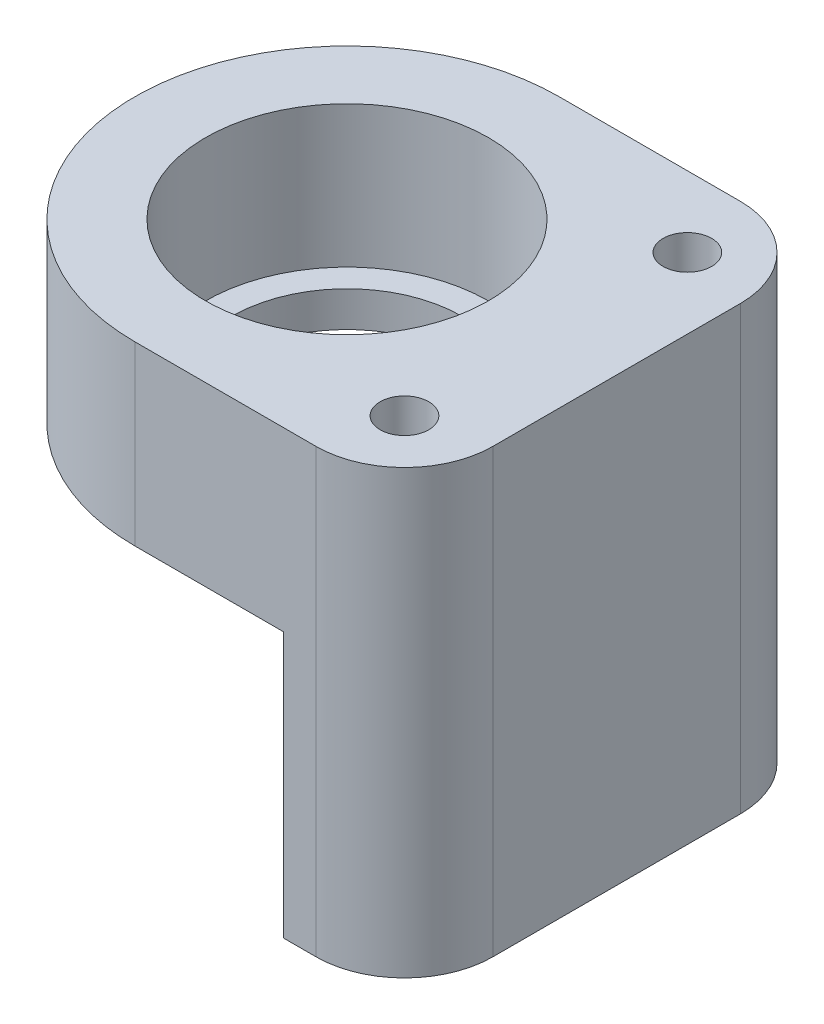
ISO-10303-21;
HEADER;
FILE_DESCRIPTION(('STEP AP214'),'2;1');
FILE_NAME('part.step','',(''),(''),'','','');
FILE_SCHEMA(('AUTOMOTIVE_DESIGN { 1 0 10303 214 1 1 1 1 }'));
ENDSEC;
DATA;
#1=APPLICATION_CONTEXT('core data for automotive mechanical design processes');
#2=APPLICATION_PROTOCOL_DEFINITION('international standard','automotive_design',2000,#1);
#3=PRODUCT_CONTEXT('',#1,'mechanical');
#4=PRODUCT('Part','Part','',(#3));
#5=PRODUCT_RELATED_PRODUCT_CATEGORY('part','',(#4));
#6=PRODUCT_DEFINITION_FORMATION('','',#4);
#7=PRODUCT_DEFINITION_CONTEXT('part definition',#1,'design');
#8=PRODUCT_DEFINITION('design','',#6,#7);
#9=PRODUCT_DEFINITION_SHAPE('','',#8);
#10=(LENGTH_UNIT() NAMED_UNIT(*) SI_UNIT(.MILLI.,.METRE.));
#11=(NAMED_UNIT(*) PLANE_ANGLE_UNIT() SI_UNIT($,.RADIAN.));
#12=(NAMED_UNIT(*) SI_UNIT($,.STERADIAN.) SOLID_ANGLE_UNIT());
#13=UNCERTAINTY_MEASURE_WITH_UNIT(LENGTH_MEASURE(1.E-05),#10,'distance_accuracy_value','');
#14=(GEOMETRIC_REPRESENTATION_CONTEXT(3) GLOBAL_UNCERTAINTY_ASSIGNED_CONTEXT((#13)) GLOBAL_UNIT_ASSIGNED_CONTEXT((#10,
#11,#12)) REPRESENTATION_CONTEXT('',''));
#15=CARTESIAN_POINT('',(0.,0.,0.));
#16=DIRECTION('',(0.,0.,1.));
#17=DIRECTION('',(1.,0.,0.));
#18=AXIS2_PLACEMENT_3D('',#15,#16,#17);
#19=CARTESIAN_POINT('',(-24.,0.,0.));
#20=DIRECTION('',(0.,1.,0.));
#21=DIRECTION('',(0.,0.,1.));
#22=AXIS2_PLACEMENT_3D('',#19,#20,#21);
#23=PLANE('',#22);
#24=CARTESIAN_POINT('',(22.5,0.,-16.));
#25=DIRECTION('',(0.,-1.,0.));
#26=DIRECTION('',(0.,0.,-1.));
#27=AXIS2_PLACEMENT_3D('',#24,#25,#26);
#28=CIRCLE('',#27,2.74999999999999);
#29=CARTESIAN_POINT('',(22.5,0.,-18.75));
#30=VERTEX_POINT('',#29);
#31=EDGE_CURVE('E383',#30,#30,#28,.T.);
#32=ORIENTED_EDGE('',*,*,#31,.F.);
#33=EDGE_LOOP('',(#32));
#34=FACE_BOUND('',#33,.T.);
#35=CARTESIAN_POINT('',(24.5,0.,9.));
#36=DIRECTION('',(0.,-1.,0.));
#37=DIRECTION('',(0.,0.,-1.));
#38=AXIS2_PLACEMENT_3D('',#35,#36,#37);
#39=CIRCLE('',#38,1.49999999999999);
#40=CARTESIAN_POINT('',(24.5,0.,7.50000000000001));
#41=VERTEX_POINT('',#40);
#42=EDGE_CURVE('E148',#41,#41,#39,.T.);
#43=ORIENTED_EDGE('',*,*,#42,.F.);
#44=EDGE_LOOP('',(#43));
#45=FACE_BOUND('',#44,.T.);
#46=CARTESIAN_POINT('',(24.5,0.,-9.));
#47=DIRECTION('',(0.,-1.,0.));
#48=DIRECTION('',(0.,0.,-1.));
#49=AXIS2_PLACEMENT_3D('',#46,#47,#48);
#50=CIRCLE('',#49,1.49999999999999);
#51=CARTESIAN_POINT('',(24.5,0.,-10.5));
#52=VERTEX_POINT('',#51);
#53=EDGE_CURVE('E147',#52,#52,#50,.T.);
#54=ORIENTED_EDGE('',*,*,#53,.F.);
#55=EDGE_LOOP('',(#54));
#56=FACE_BOUND('',#55,.T.);
#57=DIRECTION('',(-0.308662393745259,0.,-0.951171659947586));
#58=VECTOR('',#57,1.);
#59=CARTESIAN_POINT('',(15.0852726124611,0.,18.6664016405876));
#60=LINE('',#59,#58);
#61=CARTESIAN_POINT('',(16.8160655978017,0.,24.));
#62=VERTEX_POINT('',#61);
#63=CARTESIAN_POINT('',(15.0852726124611,0.,18.6664016405876));
#64=VERTEX_POINT('',#63);
#65=EDGE_CURVE('E163',#62,#64,#60,.T.);
#66=ORIENTED_EDGE('',*,*,#65,.T.);
#67=DIRECTION('',(-0.628553025519213,0.,-0.777766735024483));
#68=VECTOR('',#67,1.);
#69=CARTESIAN_POINT('',(0.,0.,0.));
#70=LINE('',#69,#68);
#71=CARTESIAN_POINT('',(12.5710605103843,0.,15.5553347004896));
#72=VERTEX_POINT('',#71);
#73=EDGE_CURVE('E178',#64,#72,#70,.T.);
#74=ORIENTED_EDGE('',*,*,#73,.T.);
#75=CARTESIAN_POINT('',(0.,0.,0.));
#76=DIRECTION('',(0.,-1.,0.));
#77=DIRECTION('',(0.,0.,-1.));
#78=AXIS2_PLACEMENT_3D('',#75,#76,#77);
#79=CIRCLE('',#78,20.);
#80=CARTESIAN_POINT('',(-5.76280411150831,0.,-19.1517646386014));
#81=VERTEX_POINT('',#80);
#82=EDGE_CURVE('E256',#81,#72,#79,.T.);
#83=ORIENTED_EDGE('',*,*,#82,.F.);
#84=DIRECTION('',(-0.288140205575415,0.,-0.95758823193007));
#85=VECTOR('',#84,1.);
#86=CARTESIAN_POINT('',(-6.91536493380997,0.,-22.9821175663217));
#87=LINE('',#86,#85);
#88=CARTESIAN_POINT('',(-6.91536493380997,0.,-22.9821175663217));
#89=VERTEX_POINT('',#88);
#90=EDGE_CURVE('E167',#81,#89,#87,.T.);
#91=ORIENTED_EDGE('',*,*,#90,.T.);
#92=CARTESIAN_POINT('',(0.,0.,0.));
#93=DIRECTION('',(0.,-1.,0.));
#94=DIRECTION('',(0.,0.,-1.));
#95=AXIS2_PLACEMENT_3D('',#92,#93,#94);
#96=CIRCLE('',#95,24.);
#97=CARTESIAN_POINT('',(0.,0.,-24.));
#98=VERTEX_POINT('',#97);
#99=EDGE_CURVE('E77',#89,#98,#96,.T.);
#100=ORIENTED_EDGE('',*,*,#99,.T.);
#101=DIRECTION('',(1.,0.,0.));
#102=VECTOR('',#101,1.);
#103=CARTESIAN_POINT('',(20.5,0.,-24.));
#104=LINE('',#103,#102);
#105=CARTESIAN_POINT('',(20.5,0.,-24.));
#106=VERTEX_POINT('',#105);
#107=EDGE_CURVE('E208',#98,#106,#104,.T.);
#108=ORIENTED_EDGE('',*,*,#107,.T.);
#109=CARTESIAN_POINT('',(20.5,0.,-14.));
#110=DIRECTION('',(0.,1.,0.));
#111=DIRECTION('',(0.,0.,1.));
#112=AXIS2_PLACEMENT_3D('',#109,#110,#111);
#113=CIRCLE('',#112,10.);
#114=CARTESIAN_POINT('',(30.5,0.,-14.));
#115=VERTEX_POINT('',#114);
#116=EDGE_CURVE('E205',#106,#115,#113,.F.);
#117=ORIENTED_EDGE('',*,*,#116,.T.);
#118=DIRECTION('',(0.,0.,1.));
#119=VECTOR('',#118,1.);
#120=CARTESIAN_POINT('',(30.5,0.,14.));
#121=LINE('',#120,#119);
#122=CARTESIAN_POINT('',(30.5,0.,14.));
#123=VERTEX_POINT('',#122);
#124=EDGE_CURVE('E66',#115,#123,#121,.T.);
#125=ORIENTED_EDGE('',*,*,#124,.T.);
#126=CARTESIAN_POINT('',(20.5,0.,14.));
#127=DIRECTION('',(0.,1.,0.));
#128=DIRECTION('',(0.,0.,1.));
#129=AXIS2_PLACEMENT_3D('',#126,#127,#128);
#130=CIRCLE('',#129,10.);
#131=CARTESIAN_POINT('',(20.5,0.,24.));
#132=VERTEX_POINT('',#131);
#133=EDGE_CURVE('E82',#123,#132,#130,.F.);
#134=ORIENTED_EDGE('',*,*,#133,.T.);
#135=DIRECTION('',(-1.,0.,0.));
#136=VECTOR('',#135,1.);
#137=CARTESIAN_POINT('',(0.,0.,24.));
#138=LINE('',#137,#136);
#139=EDGE_CURVE('E211',#132,#62,#138,.T.);
#140=ORIENTED_EDGE('',*,*,#139,.T.);
#141=EDGE_LOOP('',(#66,#74,#83,#91,#100,#108,#117,#125,#134,#140));
#142=FACE_BOUND('',#141,.T.);
#143=CARTESIAN_POINT('',(22.5,0.,16.));
#144=DIRECTION('',(0.,-1.,0.));
#145=DIRECTION('',(0.,0.,-1.));
#146=AXIS2_PLACEMENT_3D('',#143,#144,#145);
#147=CIRCLE('',#146,2.74999999999999);
#148=CARTESIAN_POINT('',(22.5,0.,13.25));
#149=VERTEX_POINT('',#148);
#150=EDGE_CURVE('E390',#149,#149,#147,.T.);
#151=ORIENTED_EDGE('',*,*,#150,.F.);
#152=EDGE_LOOP('',(#151));
#153=FACE_BOUND('',#152,.T.);
#154=ADVANCED_FACE('F41',(#34,#45,#56,#142,#153),#23,.F.);
#155=CARTESIAN_POINT('',(0.,0.,0.));
#156=DIRECTION('',(0.,-1.,0.));
#157=DIRECTION('',(0.,0.,-1.));
#158=AXIS2_PLACEMENT_3D('',#155,#156,#157);
#159=CYLINDRICAL_SURFACE('',#158,20.);
#160=DIRECTION('',(0.,-1.,0.));
#161=VECTOR('',#160,1.);
#162=CARTESIAN_POINT('',(12.5710605103843,0.,15.5553347004897));
#163=LINE('',#162,#161);
#164=CARTESIAN_POINT('',(12.5710605103843,30.,15.5553347004897));
#165=VERTEX_POINT('',#164);
#166=EDGE_CURVE('E196',#165,#72,#163,.T.);
#167=ORIENTED_EDGE('',*,*,#166,.F.);
#168=CARTESIAN_POINT('',(0.,30.,0.));
#169=DIRECTION('',(0.,-1.,0.));
#170=DIRECTION('',(0.,0.,-1.));
#171=AXIS2_PLACEMENT_3D('',#168,#169,#170);
#172=CIRCLE('',#171,20.);
#173=CARTESIAN_POINT('',(-5.76280411150831,30.,-19.1517646386014));
#174=VERTEX_POINT('',#173);
#175=EDGE_CURVE('E260',#174,#165,#172,.T.);
#176=ORIENTED_EDGE('',*,*,#175,.F.);
#177=DIRECTION('',(0.,-1.,0.));
#178=VECTOR('',#177,1.);
#179=CARTESIAN_POINT('',(-5.76280411150831,0.,-19.1517646386014));
#180=LINE('',#179,#178);
#181=EDGE_CURVE('E193',#81,#174,#180,.F.);
#182=ORIENTED_EDGE('',*,*,#181,.F.);
#183=ORIENTED_EDGE('',*,*,#82,.T.);
#184=EDGE_LOOP('',(#167,#176,#182,#183));
#185=FACE_BOUND('',#184,.T.);
#186=ADVANCED_FACE('F323',(#185),#159,.F.);
#187=CARTESIAN_POINT('',(0.,0.,0.));
#188=DIRECTION('',(0.,-1.,0.));
#189=DIRECTION('',(0.,0.,-1.));
#190=AXIS2_PLACEMENT_3D('',#187,#188,#189);
#191=CYLINDRICAL_SURFACE('',#190,24.);
#192=DIRECTION('',(0.,-1.,0.));
#193=VECTOR('',#192,1.);
#194=CARTESIAN_POINT('',(-6.91536493380997,30.,-22.9821175663217));
#195=LINE('',#194,#193);
#196=CARTESIAN_POINT('',(-6.91536493380997,30.,-22.9821175663217));
#197=VERTEX_POINT('',#196);
#198=EDGE_CURVE('E174',#197,#89,#195,.T.);
#199=ORIENTED_EDGE('',*,*,#198,.F.);
#200=CARTESIAN_POINT('',(0.,30.,0.));
#201=DIRECTION('',(0.,1.,0.));
#202=DIRECTION('',(0.,0.,1.));
#203=AXIS2_PLACEMENT_3D('',#200,#201,#202);
#204=CIRCLE('',#203,24.);
#205=CARTESIAN_POINT('',(0.,30.,24.));
#206=VERTEX_POINT('',#205);
#207=EDGE_CURVE('E189',#197,#206,#204,.T.);
#208=ORIENTED_EDGE('',*,*,#207,.T.);
#209=DIRECTION('',(0.,1.,0.));
#210=VECTOR('',#209,1.);
#211=CARTESIAN_POINT('',(0.,-56.8704668523127,24.));
#212=LINE('',#211,#210);
#213=CARTESIAN_POINT('',(0.,50.,24.));
#214=VERTEX_POINT('',#213);
#215=EDGE_CURVE('E231',#206,#214,#212,.T.);
#216=ORIENTED_EDGE('',*,*,#215,.T.);
#217=CARTESIAN_POINT('',(0.,50.,0.));
#218=DIRECTION('',(0.,-1.,0.));
#219=DIRECTION('',(0.,0.,-1.));
#220=AXIS2_PLACEMENT_3D('',#217,#218,#219);
#221=CIRCLE('',#220,24.);
#222=CARTESIAN_POINT('',(0.,50.,-24.));
#223=VERTEX_POINT('',#222);
#224=EDGE_CURVE('E250',#214,#223,#221,.T.);
#225=ORIENTED_EDGE('',*,*,#224,.T.);
#226=DIRECTION('',(0.,1.,0.));
#227=VECTOR('',#226,1.);
#228=CARTESIAN_POINT('',(0.,-56.8704668523127,-24.));
#229=LINE('',#228,#227);
#230=EDGE_CURVE('E202',#98,#223,#229,.T.);
#231=ORIENTED_EDGE('',*,*,#230,.F.);
#232=ORIENTED_EDGE('',*,*,#99,.F.);
#233=EDGE_LOOP('',(#199,#208,#216,#225,#231,#232));
#234=FACE_BOUND('',#233,.T.);
#235=ADVANCED_FACE('F288',(#234),#191,.T.);
#236=CARTESIAN_POINT('',(0.,-56.8704668523127,24.));
#237=DIRECTION('',(0.,0.,1.));
#238=DIRECTION('',(1.,0.,0.));
#239=AXIS2_PLACEMENT_3D('',#236,#237,#238);
#240=PLANE('',#239);
#241=DIRECTION('',(-1.,0.,0.));
#242=VECTOR('',#241,1.);
#243=CARTESIAN_POINT('',(0.,30.,24.));
#244=LINE('',#243,#242);
#245=CARTESIAN_POINT('',(16.8160655978017,30.,24.));
#246=VERTEX_POINT('',#245);
#247=EDGE_CURVE('E50',#246,#206,#244,.T.);
#248=ORIENTED_EDGE('',*,*,#247,.F.);
#249=DIRECTION('',(0.,-1.,0.));
#250=VECTOR('',#249,1.);
#251=CARTESIAN_POINT('',(16.8160655978017,-56.8704668523127,24.));
#252=LINE('',#251,#250);
#253=EDGE_CURVE('E11',#246,#62,#252,.T.);
#254=ORIENTED_EDGE('',*,*,#253,.T.);
#255=ORIENTED_EDGE('',*,*,#139,.F.);
#256=DIRECTION('',(0.,1.,0.));
#257=VECTOR('',#256,1.);
#258=CARTESIAN_POINT('',(20.5,-56.8704668523127,24.));
#259=LINE('',#258,#257);
#260=CARTESIAN_POINT('',(20.5,50.,24.));
#261=VERTEX_POINT('',#260);
#262=EDGE_CURVE('E243',#132,#261,#259,.T.);
#263=ORIENTED_EDGE('',*,*,#262,.T.);
#264=DIRECTION('',(1.,0.,0.));
#265=VECTOR('',#264,1.);
#266=CARTESIAN_POINT('',(0.,50.,24.));
#267=LINE('',#266,#265);
#268=EDGE_CURVE('E199',#214,#261,#267,.T.);
#269=ORIENTED_EDGE('',*,*,#268,.F.);
#270=ORIENTED_EDGE('',*,*,#215,.F.);
#271=EDGE_LOOP('',(#248,#254,#255,#263,#269,#270));
#272=FACE_BOUND('',#271,.T.);
#273=ADVANCED_FACE('F290',(#272),#240,.T.);
#274=CARTESIAN_POINT('',(-16.,50.,0.));
#275=DIRECTION('',(0.,-1.,0.));
#276=DIRECTION('',(0.,0.,-1.));
#277=AXIS2_PLACEMENT_3D('',#274,#275,#276);
#278=PLANE('',#277);
#279=CARTESIAN_POINT('',(22.5,50.,16.));
#280=DIRECTION('',(0.,-1.,0.));
#281=DIRECTION('',(0.,0.,-1.));
#282=AXIS2_PLACEMENT_3D('',#279,#280,#281);
#283=CIRCLE('',#282,2.74999999999999);
#284=CARTESIAN_POINT('',(22.5,50.,13.25));
#285=VERTEX_POINT('',#284);
#286=EDGE_CURVE('E378',#285,#285,#283,.T.);
#287=ORIENTED_EDGE('',*,*,#286,.T.);
#288=EDGE_LOOP('',(#287));
#289=FACE_BOUND('',#288,.T.);
#290=CARTESIAN_POINT('',(22.5,50.,-16.));
#291=DIRECTION('',(0.,-1.,0.));
#292=DIRECTION('',(0.,0.,-1.));
#293=AXIS2_PLACEMENT_3D('',#290,#291,#292);
#294=CIRCLE('',#293,2.74999999999999);
#295=CARTESIAN_POINT('',(22.5,50.,-18.75));
#296=VERTEX_POINT('',#295);
#297=EDGE_CURVE('E156',#296,#296,#294,.T.);
#298=ORIENTED_EDGE('',*,*,#297,.T.);
#299=EDGE_LOOP('',(#298));
#300=FACE_BOUND('',#299,.T.);
#301=ORIENTED_EDGE('',*,*,#224,.F.);
#302=ORIENTED_EDGE('',*,*,#268,.T.);
#303=CARTESIAN_POINT('',(20.5,50.,14.));
#304=DIRECTION('',(0.,1.,0.));
#305=DIRECTION('',(0.,0.,1.));
#306=AXIS2_PLACEMENT_3D('',#303,#304,#305);
#307=CIRCLE('',#306,10.);
#308=CARTESIAN_POINT('',(30.5,50.,14.));
#309=VERTEX_POINT('',#308);
#310=EDGE_CURVE('E215',#261,#309,#307,.T.);
#311=ORIENTED_EDGE('',*,*,#310,.T.);
#312=DIRECTION('',(0.,0.,-1.));
#313=VECTOR('',#312,1.);
#314=CARTESIAN_POINT('',(30.5,50.,14.));
#315=LINE('',#314,#313);
#316=CARTESIAN_POINT('',(30.5,50.,-14.));
#317=VERTEX_POINT('',#316);
#318=EDGE_CURVE('E219',#309,#317,#315,.T.);
#319=ORIENTED_EDGE('',*,*,#318,.T.);
#320=CARTESIAN_POINT('',(20.5,50.,-14.));
#321=DIRECTION('',(0.,1.,0.));
#322=DIRECTION('',(0.,0.,1.));
#323=AXIS2_PLACEMENT_3D('',#320,#321,#322);
#324=CIRCLE('',#323,10.);
#325=CARTESIAN_POINT('',(20.5,50.,-24.));
#326=VERTEX_POINT('',#325);
#327=EDGE_CURVE('E223',#317,#326,#324,.T.);
#328=ORIENTED_EDGE('',*,*,#327,.T.);
#329=DIRECTION('',(-1.,0.,0.));
#330=VECTOR('',#329,1.);
#331=CARTESIAN_POINT('',(20.5,50.,-24.));
#332=LINE('',#331,#330);
#333=EDGE_CURVE('E227',#326,#223,#332,.T.);
#334=ORIENTED_EDGE('',*,*,#333,.T.);
#335=EDGE_LOOP('',(#301,#302,#311,#319,#328,#334));
#336=FACE_BOUND('',#335,.T.);
#337=CARTESIAN_POINT('',(0.,50.,0.));
#338=DIRECTION('',(0.,-1.,0.));
#339=DIRECTION('',(0.,0.,-1.));
#340=AXIS2_PLACEMENT_3D('',#337,#338,#339);
#341=CIRCLE('',#340,16.);
#342=CARTESIAN_POINT('',(0.,50.,-16.));
#343=VERTEX_POINT('',#342);
#344=EDGE_CURVE('E276',#343,#343,#341,.T.);
#345=ORIENTED_EDGE('',*,*,#344,.T.);
#346=EDGE_LOOP('',(#345));
#347=FACE_BOUND('',#346,.T.);
#348=ADVANCED_FACE('F43',(#289,#300,#336,#347),#278,.F.);
#349=CARTESIAN_POINT('',(0.,0.,0.));
#350=DIRECTION('',(0.,-1.,0.));
#351=DIRECTION('',(0.,0.,-1.));
#352=AXIS2_PLACEMENT_3D('',#349,#350,#351);
#353=CYLINDRICAL_SURFACE('',#352,16.);
#354=ORIENTED_EDGE('',*,*,#344,.F.);
#355=EDGE_LOOP('',(#354));
#356=FACE_BOUND('',#355,.T.);
#357=CARTESIAN_POINT('',(0.,34.,0.));
#358=DIRECTION('',(0.,-1.,0.));
#359=DIRECTION('',(0.,0.,-1.));
#360=AXIS2_PLACEMENT_3D('',#357,#358,#359);
#361=CIRCLE('',#360,16.);
#362=CARTESIAN_POINT('',(0.,34.,-16.));
#363=VERTEX_POINT('',#362);
#364=EDGE_CURVE('E272',#363,#363,#361,.T.);
#365=ORIENTED_EDGE('',*,*,#364,.T.);
#366=EDGE_LOOP('',(#365));
#367=FACE_BOUND('',#366,.T.);
#368=ADVANCED_FACE('F357',(#356,#367),#353,.F.);
#369=CARTESIAN_POINT('',(-13.,34.,0.));
#370=DIRECTION('',(0.,-1.,0.));
#371=DIRECTION('',(0.,0.,-1.));
#372=AXIS2_PLACEMENT_3D('',#369,#370,#371);
#373=PLANE('',#372);
#374=ORIENTED_EDGE('',*,*,#364,.F.);
#375=EDGE_LOOP('',(#374));
#376=FACE_BOUND('',#375,.T.);
#377=CARTESIAN_POINT('',(0.,34.,0.));
#378=DIRECTION('',(0.,-1.,0.));
#379=DIRECTION('',(0.,0.,-1.));
#380=AXIS2_PLACEMENT_3D('',#377,#378,#379);
#381=CIRCLE('',#380,13.);
#382=CARTESIAN_POINT('',(0.,34.,-13.));
#383=VERTEX_POINT('',#382);
#384=EDGE_CURVE('E268',#383,#383,#381,.T.);
#385=ORIENTED_EDGE('',*,*,#384,.T.);
#386=EDGE_LOOP('',(#385));
#387=FACE_BOUND('',#386,.T.);
#388=ADVANCED_FACE('F354',(#376,#387),#373,.F.);
#389=CARTESIAN_POINT('',(0.,0.,0.));
#390=DIRECTION('',(0.,-1.,0.));
#391=DIRECTION('',(0.,0.,-1.));
#392=AXIS2_PLACEMENT_3D('',#389,#390,#391);
#393=CYLINDRICAL_SURFACE('',#392,13.);
#394=ORIENTED_EDGE('',*,*,#384,.F.);
#395=EDGE_LOOP('',(#394));
#396=FACE_BOUND('',#395,.T.);
#397=CARTESIAN_POINT('',(0.,30.,0.));
#398=DIRECTION('',(0.,-1.,0.));
#399=DIRECTION('',(0.,0.,-1.));
#400=AXIS2_PLACEMENT_3D('',#397,#398,#399);
#401=CIRCLE('',#400,13.);
#402=CARTESIAN_POINT('',(0.,30.,-13.));
#403=VERTEX_POINT('',#402);
#404=EDGE_CURVE('E264',#403,#403,#401,.T.);
#405=ORIENTED_EDGE('',*,*,#404,.T.);
#406=EDGE_LOOP('',(#405));
#407=FACE_BOUND('',#406,.T.);
#408=ADVANCED_FACE('F351',(#396,#407),#393,.F.);
#409=CARTESIAN_POINT('',(-20.,30.,0.));
#410=DIRECTION('',(0.,1.,0.));
#411=DIRECTION('',(0.,0.,1.));
#412=AXIS2_PLACEMENT_3D('',#409,#410,#411);
#413=PLANE('',#412);
#414=ORIENTED_EDGE('',*,*,#175,.T.);
#415=DIRECTION('',(-0.628553025519213,0.,-0.777766735024483));
#416=VECTOR('',#415,1.);
#417=CARTESIAN_POINT('',(0.,30.,0.));
#418=LINE('',#417,#416);
#419=CARTESIAN_POINT('',(15.0852726124611,30.,18.6664016405876));
#420=VERTEX_POINT('',#419);
#421=EDGE_CURVE('E166',#420,#165,#418,.T.);
#422=ORIENTED_EDGE('',*,*,#421,.F.);
#423=DIRECTION('',(-0.308662393745259,0.,-0.951171659947586));
#424=VECTOR('',#423,1.);
#425=CARTESIAN_POINT('',(15.0852726124611,30.,18.6664016405876));
#426=LINE('',#425,#424);
#427=EDGE_CURVE('E57',#246,#420,#426,.T.);
#428=ORIENTED_EDGE('',*,*,#427,.F.);
#429=ORIENTED_EDGE('',*,*,#247,.T.);
#430=ORIENTED_EDGE('',*,*,#207,.F.);
#431=DIRECTION('',(-0.288140205575415,0.,-0.95758823193007));
#432=VECTOR('',#431,1.);
#433=CARTESIAN_POINT('',(-6.91536493380997,30.,-22.9821175663217));
#434=LINE('',#433,#432);
#435=EDGE_CURVE('E170',#174,#197,#434,.T.);
#436=ORIENTED_EDGE('',*,*,#435,.F.);
#437=EDGE_LOOP('',(#414,#422,#428,#429,#430,#436));
#438=FACE_BOUND('',#437,.T.);
#439=ORIENTED_EDGE('',*,*,#404,.F.);
#440=EDGE_LOOP('',(#439));
#441=FACE_BOUND('',#440,.T.);
#442=ADVANCED_FACE('F281',(#438,#441),#413,.F.);
#443=CARTESIAN_POINT('',(20.5,-56.8704668523127,-24.));
#444=DIRECTION('',(0.,0.,-1.));
#445=DIRECTION('',(-1.,0.,0.));
#446=AXIS2_PLACEMENT_3D('',#443,#444,#445);
#447=PLANE('',#446);
#448=ORIENTED_EDGE('',*,*,#107,.F.);
#449=ORIENTED_EDGE('',*,*,#230,.T.);
#450=ORIENTED_EDGE('',*,*,#333,.F.);
#451=DIRECTION('',(0.,1.,0.));
#452=VECTOR('',#451,1.);
#453=CARTESIAN_POINT('',(20.5,-56.8704668523127,-24.));
#454=LINE('',#453,#452);
#455=EDGE_CURVE('E234',#106,#326,#454,.T.);
#456=ORIENTED_EDGE('',*,*,#455,.F.);
#457=EDGE_LOOP('',(#448,#449,#450,#456));
#458=FACE_BOUND('',#457,.T.);
#459=ADVANCED_FACE('F299',(#458),#447,.T.);
#460=CARTESIAN_POINT('',(20.5,-56.8704668523127,-14.));
#461=DIRECTION('',(0.,1.,0.));
#462=DIRECTION('',(0.,0.,1.));
#463=AXIS2_PLACEMENT_3D('',#460,#461,#462);
#464=CYLINDRICAL_SURFACE('',#463,10.);
#465=ORIENTED_EDGE('',*,*,#116,.F.);
#466=ORIENTED_EDGE('',*,*,#455,.T.);
#467=ORIENTED_EDGE('',*,*,#327,.F.);
#468=DIRECTION('',(0.,1.,0.));
#469=VECTOR('',#468,1.);
#470=CARTESIAN_POINT('',(30.5,-56.8704668523127,-14.));
#471=LINE('',#470,#469);
#472=EDGE_CURVE('E237',#115,#317,#471,.T.);
#473=ORIENTED_EDGE('',*,*,#472,.F.);
#474=EDGE_LOOP('',(#465,#466,#467,#473));
#475=FACE_BOUND('',#474,.T.);
#476=ADVANCED_FACE('F305',(#475),#464,.T.);
#477=CARTESIAN_POINT('',(30.5,-56.8704668523127,14.));
#478=DIRECTION('',(1.,0.,0.));
#479=DIRECTION('',(0.,0.,-1.));
#480=AXIS2_PLACEMENT_3D('',#477,#478,#479);
#481=PLANE('',#480);
#482=ORIENTED_EDGE('',*,*,#124,.F.);
#483=ORIENTED_EDGE('',*,*,#472,.T.);
#484=ORIENTED_EDGE('',*,*,#318,.F.);
#485=DIRECTION('',(0.,1.,0.));
#486=VECTOR('',#485,1.);
#487=CARTESIAN_POINT('',(30.5,-56.8704668523127,14.));
#488=LINE('',#487,#486);
#489=EDGE_CURVE('E240',#123,#309,#488,.T.);
#490=ORIENTED_EDGE('',*,*,#489,.F.);
#491=EDGE_LOOP('',(#482,#483,#484,#490));
#492=FACE_BOUND('',#491,.T.);
#493=ADVANCED_FACE('F309',(#492),#481,.T.);
#494=CARTESIAN_POINT('',(20.5,-56.8704668523127,14.));
#495=DIRECTION('',(0.,1.,0.));
#496=DIRECTION('',(0.,0.,1.));
#497=AXIS2_PLACEMENT_3D('',#494,#495,#496);
#498=CYLINDRICAL_SURFACE('',#497,10.);
#499=ORIENTED_EDGE('',*,*,#133,.F.);
#500=ORIENTED_EDGE('',*,*,#489,.T.);
#501=ORIENTED_EDGE('',*,*,#310,.F.);
#502=ORIENTED_EDGE('',*,*,#262,.F.);
#503=EDGE_LOOP('',(#499,#500,#501,#502));
#504=FACE_BOUND('',#503,.T.);
#505=ADVANCED_FACE('F312',(#504),#498,.T.);
#506=CARTESIAN_POINT('',(0.,30.,0.));
#507=DIRECTION('',(-0.777766735024483,0.,0.628553025519213));
#508=DIRECTION('',(0.628553025519213,0.,0.777766735024483));
#509=AXIS2_PLACEMENT_3D('',#506,#507,#508);
#510=PLANE('',#509);
#511=ORIENTED_EDGE('',*,*,#166,.T.);
#512=ORIENTED_EDGE('',*,*,#73,.F.);
#513=DIRECTION('',(0.,-1.,0.));
#514=VECTOR('',#513,1.);
#515=CARTESIAN_POINT('',(15.0852726124611,30.,18.6664016405876));
#516=LINE('',#515,#514);
#517=EDGE_CURVE('E186',#420,#64,#516,.T.);
#518=ORIENTED_EDGE('',*,*,#517,.F.);
#519=ORIENTED_EDGE('',*,*,#421,.T.);
#520=EDGE_LOOP('',(#511,#512,#518,#519));
#521=FACE_BOUND('',#520,.T.);
#522=ADVANCED_FACE('F319',(#521),#510,.T.);
#523=CARTESIAN_POINT('',(-6.91536493380997,30.,-22.9821175663217));
#524=DIRECTION('',(-0.95758823193007,0.,0.288140205575415));
#525=DIRECTION('',(0.288140205575415,0.,0.95758823193007));
#526=AXIS2_PLACEMENT_3D('',#523,#524,#525);
#527=PLANE('',#526);
#528=ORIENTED_EDGE('',*,*,#181,.T.);
#529=ORIENTED_EDGE('',*,*,#435,.T.);
#530=ORIENTED_EDGE('',*,*,#198,.T.);
#531=ORIENTED_EDGE('',*,*,#90,.F.);
#532=EDGE_LOOP('',(#528,#529,#530,#531));
#533=FACE_BOUND('',#532,.T.);
#534=ADVANCED_FACE('F326',(#533),#527,.T.);
#535=CARTESIAN_POINT('',(15.0852726124611,30.,18.6664016405876));
#536=DIRECTION('',(-0.951171659947586,0.,0.308662393745259));
#537=DIRECTION('',(0.308662393745259,0.,0.951171659947586));
#538=AXIS2_PLACEMENT_3D('',#535,#536,#537);
#539=PLANE('',#538);
#540=ORIENTED_EDGE('',*,*,#427,.T.);
#541=ORIENTED_EDGE('',*,*,#517,.T.);
#542=ORIENTED_EDGE('',*,*,#65,.F.);
#543=ORIENTED_EDGE('',*,*,#253,.F.);
#544=EDGE_LOOP('',(#540,#541,#542,#543));
#545=FACE_BOUND('',#544,.T.);
#546=ADVANCED_FACE('F316',(#545),#539,.T.);
#547=CARTESIAN_POINT('',(24.5,6.,-9.));
#548=DIRECTION('',(0.,-1.,0.));
#549=DIRECTION('',(0.,0.,-1.));
#550=AXIS2_PLACEMENT_3D('',#547,#548,#549);
#551=CONICAL_SURFACE('',#550,1.49999999999999,1.02974425867665);
#552=CARTESIAN_POINT('',(24.5,6.90129092854134,-9.));
#553=VERTEX_POINT('',#552);
#554=VERTEX_LOOP('',#553);
#555=FACE_BOUND('',#554,.T.);
#556=CARTESIAN_POINT('',(24.5,6.,-9.));
#557=DIRECTION('',(0.,-1.,0.));
#558=DIRECTION('',(0.,0.,-1.));
#559=AXIS2_PLACEMENT_3D('',#556,#557,#558);
#560=CIRCLE('',#559,1.49999999999999);
#561=CARTESIAN_POINT('',(24.5,6.,-10.5));
#562=VERTEX_POINT('',#561);
#563=EDGE_CURVE('E153',#562,#562,#560,.T.);
#564=ORIENTED_EDGE('',*,*,#563,.T.);
#565=EDGE_LOOP('',(#564));
#566=FACE_BOUND('',#565,.T.);
#567=ADVANCED_FACE('F333',(#555,#566),#551,.F.);
#568=CARTESIAN_POINT('',(24.5,0.,-9.));
#569=DIRECTION('',(0.,-1.,0.));
#570=DIRECTION('',(0.,0.,-1.));
#571=AXIS2_PLACEMENT_3D('',#568,#569,#570);
#572=CYLINDRICAL_SURFACE('',#571,1.49999999999999);
#573=ORIENTED_EDGE('',*,*,#563,.F.);
#574=EDGE_LOOP('',(#573));
#575=FACE_BOUND('',#574,.T.);
#576=ORIENTED_EDGE('',*,*,#53,.T.);
#577=EDGE_LOOP('',(#576));
#578=FACE_BOUND('',#577,.T.);
#579=ADVANCED_FACE('F140',(#575,#578),#572,.F.);
#580=CARTESIAN_POINT('',(24.5,6.,9.));
#581=DIRECTION('',(0.,-1.,0.));
#582=DIRECTION('',(0.,0.,-1.));
#583=AXIS2_PLACEMENT_3D('',#580,#581,#582);
#584=CONICAL_SURFACE('',#583,1.49999999999999,1.02974425867665);
#585=CARTESIAN_POINT('',(24.5,6.90129092854134,9.));
#586=VERTEX_POINT('',#585);
#587=VERTEX_LOOP('',#586);
#588=FACE_BOUND('',#587,.T.);
#589=CARTESIAN_POINT('',(24.5,6.,9.));
#590=DIRECTION('',(0.,-1.,0.));
#591=DIRECTION('',(0.,0.,-1.));
#592=AXIS2_PLACEMENT_3D('',#589,#590,#591);
#593=CIRCLE('',#592,1.49999999999999);
#594=CARTESIAN_POINT('',(24.5,6.,7.50000000000001));
#595=VERTEX_POINT('',#594);
#596=EDGE_CURVE('E144',#595,#595,#593,.T.);
#597=ORIENTED_EDGE('',*,*,#596,.T.);
#598=EDGE_LOOP('',(#597));
#599=FACE_BOUND('',#598,.T.);
#600=ADVANCED_FACE('F136',(#588,#599),#584,.F.);
#601=CARTESIAN_POINT('',(24.5,0.,9.));
#602=DIRECTION('',(0.,-1.,0.));
#603=DIRECTION('',(0.,0.,-1.));
#604=AXIS2_PLACEMENT_3D('',#601,#602,#603);
#605=CYLINDRICAL_SURFACE('',#604,1.49999999999999);
#606=ORIENTED_EDGE('',*,*,#596,.F.);
#607=EDGE_LOOP('',(#606));
#608=FACE_BOUND('',#607,.T.);
#609=ORIENTED_EDGE('',*,*,#42,.T.);
#610=EDGE_LOOP('',(#609));
#611=FACE_BOUND('',#610,.T.);
#612=ADVANCED_FACE('F139',(#608,#611),#605,.F.);
#613=CARTESIAN_POINT('',(22.5,0.,-16.));
#614=DIRECTION('',(0.,-1.,0.));
#615=DIRECTION('',(0.,0.,-1.));
#616=AXIS2_PLACEMENT_3D('',#613,#614,#615);
#617=CYLINDRICAL_SURFACE('',#616,2.74999999999999);
#618=ORIENTED_EDGE('',*,*,#297,.F.);
#619=EDGE_LOOP('',(#618));
#620=FACE_BOUND('',#619,.T.);
#621=ORIENTED_EDGE('',*,*,#31,.T.);
#622=EDGE_LOOP('',(#621));
#623=FACE_BOUND('',#622,.T.);
#624=ADVANCED_FACE('F397',(#620,#623),#617,.F.);
#625=CARTESIAN_POINT('',(22.5,0.,16.));
#626=DIRECTION('',(0.,-1.,0.));
#627=DIRECTION('',(0.,0.,-1.));
#628=AXIS2_PLACEMENT_3D('',#625,#626,#627);
#629=CYLINDRICAL_SURFACE('',#628,2.74999999999999);
#630=ORIENTED_EDGE('',*,*,#286,.F.);
#631=EDGE_LOOP('',(#630));
#632=FACE_BOUND('',#631,.T.);
#633=ORIENTED_EDGE('',*,*,#150,.T.);
#634=EDGE_LOOP('',(#633));
#635=FACE_BOUND('',#634,.T.);
#636=ADVANCED_FACE('F395',(#632,#635),#629,.F.);
#637=CLOSED_SHELL('',(#154,#186,#235,#273,#348,#368,#388,#408,#442,#459,#476,#493,#505,#522,
#534,#546,#567,#579,#600,#612,#624,#636));
#638=MANIFOLD_SOLID_BREP('B2',#637);
#639=ADVANCED_BREP_SHAPE_REPRESENTATION('',(#18,#638),#14);
#640=SHAPE_DEFINITION_REPRESENTATION(#9,#639);
ENDSEC;
END-ISO-10303-21;
